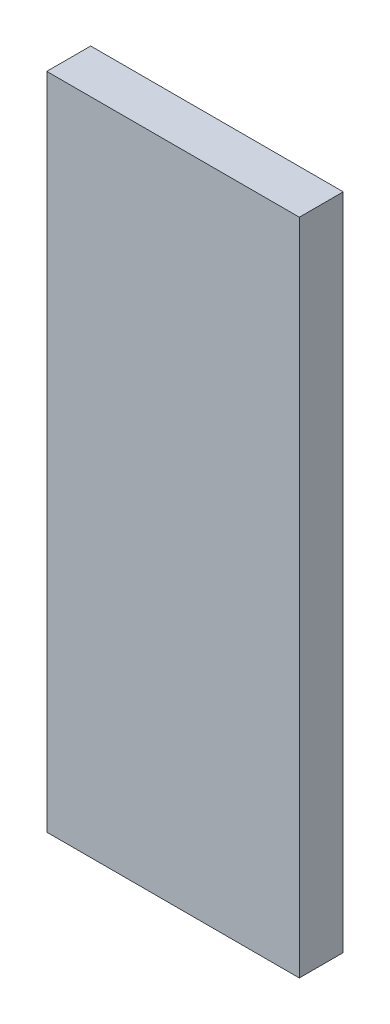
ISO-10303-21;
HEADER;
FILE_DESCRIPTION(('STEP AP214'),'2;1');
FILE_NAME('part.step','',(''),(''),'','','');
FILE_SCHEMA(('AUTOMOTIVE_DESIGN { 1 0 10303 214 1 1 1 1 }'));
ENDSEC;
DATA;
#1=APPLICATION_CONTEXT('core data for automotive mechanical design processes');
#2=APPLICATION_PROTOCOL_DEFINITION('international standard','automotive_design',2000,#1);
#3=PRODUCT_CONTEXT('',#1,'mechanical');
#4=PRODUCT('Part','Part','',(#3));
#5=PRODUCT_RELATED_PRODUCT_CATEGORY('part','',(#4));
#6=PRODUCT_DEFINITION_FORMATION('','',#4);
#7=PRODUCT_DEFINITION_CONTEXT('part definition',#1,'design');
#8=PRODUCT_DEFINITION('design','',#6,#7);
#9=PRODUCT_DEFINITION_SHAPE('','',#8);
#10=(LENGTH_UNIT() NAMED_UNIT(*) SI_UNIT(.MILLI.,.METRE.));
#11=(NAMED_UNIT(*) PLANE_ANGLE_UNIT() SI_UNIT($,.RADIAN.));
#12=(NAMED_UNIT(*) SI_UNIT($,.STERADIAN.) SOLID_ANGLE_UNIT());
#13=UNCERTAINTY_MEASURE_WITH_UNIT(LENGTH_MEASURE(1.E-05),#10,'distance_accuracy_value','');
#14=(GEOMETRIC_REPRESENTATION_CONTEXT(3) GLOBAL_UNCERTAINTY_ASSIGNED_CONTEXT((#13)) GLOBAL_UNIT_ASSIGNED_CONTEXT((#10,
#11,#12)) REPRESENTATION_CONTEXT('',''));
#15=CARTESIAN_POINT('',(0.,0.,0.));
#16=DIRECTION('',(0.,0.,1.));
#17=DIRECTION('',(1.,0.,0.));
#18=AXIS2_PLACEMENT_3D('',#15,#16,#17);
#19=CARTESIAN_POINT('',(19.,60.,-4.));
#20=DIRECTION('',(0.,-1.,0.));
#21=DIRECTION('',(0.,0.,-1.));
#22=AXIS2_PLACEMENT_3D('',#19,#20,#21);
#23=PLANE('',#22);
#24=DIRECTION('',(0.,0.,1.));
#25=VECTOR('',#24,1.);
#26=CARTESIAN_POINT('',(19.,60.,-4.));
#27=LINE('',#26,#25);
#28=CARTESIAN_POINT('',(19.,60.,-4.));
#29=VERTEX_POINT('',#28);
#30=CARTESIAN_POINT('',(19.,60.,0.));
#31=VERTEX_POINT('',#30);
#32=EDGE_CURVE('E137',#29,#31,#27,.T.);
#33=ORIENTED_EDGE('',*,*,#32,.F.);
#34=DIRECTION('',(1.,0.,0.));
#35=VECTOR('',#34,1.);
#36=CARTESIAN_POINT('',(19.,60.,-4.));
#37=LINE('',#36,#35);
#38=CARTESIAN_POINT('',(-4.,60.,-4.));
#39=VERTEX_POINT('',#38);
#40=EDGE_CURVE('E135',#39,#29,#37,.T.);
#41=ORIENTED_EDGE('',*,*,#40,.F.);
#42=DIRECTION('',(0.,0.,1.));
#43=VECTOR('',#42,1.);
#44=CARTESIAN_POINT('',(-4.,60.,-4.));
#45=LINE('',#44,#43);
#46=CARTESIAN_POINT('',(-4.,60.,0.));
#47=VERTEX_POINT('',#46);
#48=EDGE_CURVE('E147',#39,#47,#45,.T.);
#49=ORIENTED_EDGE('',*,*,#48,.T.);
#50=DIRECTION('',(1.,0.,0.));
#51=VECTOR('',#50,1.);
#52=CARTESIAN_POINT('',(19.,60.,0.));
#53=LINE('',#52,#51);
#54=EDGE_CURVE('E131',#47,#31,#53,.T.);
#55=ORIENTED_EDGE('',*,*,#54,.T.);
#56=EDGE_LOOP('',(#33,#41,#49,#55));
#57=FACE_BOUND('',#56,.T.);
#58=ADVANCED_FACE('F33',(#57),#23,.F.);
#59=CARTESIAN_POINT('',(0.,0.,0.));
#60=DIRECTION('',(0.,1.,0.));
#61=DIRECTION('',(0.,0.,1.));
#62=AXIS2_PLACEMENT_3D('',#59,#60,#61);
#63=PLANE('',#62);
#64=DIRECTION('',(-1.,0.,0.));
#65=VECTOR('',#64,1.);
#66=CARTESIAN_POINT('',(19.,0.,0.));
#67=LINE('',#66,#65);
#68=CARTESIAN_POINT('',(19.,0.,0.));
#69=VERTEX_POINT('',#68);
#70=CARTESIAN_POINT('',(-4.,0.,0.));
#71=VERTEX_POINT('',#70);
#72=EDGE_CURVE('E140',#69,#71,#67,.T.);
#73=ORIENTED_EDGE('',*,*,#72,.T.);
#74=DIRECTION('',(0.,0.,1.));
#75=VECTOR('',#74,1.);
#76=CARTESIAN_POINT('',(-4.,0.,-4.));
#77=LINE('',#76,#75);
#78=CARTESIAN_POINT('',(-4.,0.,-4.));
#79=VERTEX_POINT('',#78);
#80=EDGE_CURVE('E41',#79,#71,#77,.T.);
#81=ORIENTED_EDGE('',*,*,#80,.F.);
#82=DIRECTION('',(-1.,0.,0.));
#83=VECTOR('',#82,1.);
#84=CARTESIAN_POINT('',(19.,0.,-4.));
#85=LINE('',#84,#83);
#86=CARTESIAN_POINT('',(19.,0.,-4.));
#87=VERTEX_POINT('',#86);
#88=EDGE_CURVE('E130',#87,#79,#85,.T.);
#89=ORIENTED_EDGE('',*,*,#88,.F.);
#90=DIRECTION('',(0.,0.,1.));
#91=VECTOR('',#90,1.);
#92=CARTESIAN_POINT('',(19.,0.,-4.));
#93=LINE('',#92,#91);
#94=EDGE_CURVE('E11',#87,#69,#93,.T.);
#95=ORIENTED_EDGE('',*,*,#94,.T.);
#96=EDGE_LOOP('',(#73,#81,#89,#95));
#97=FACE_BOUND('',#96,.T.);
#98=ADVANCED_FACE('F35',(#97),#63,.F.);
#99=CARTESIAN_POINT('',(0.,0.,-4.));
#100=DIRECTION('',(0.,0.,1.));
#101=DIRECTION('',(1.,0.,0.));
#102=AXIS2_PLACEMENT_3D('',#99,#100,#101);
#103=PLANE('',#102);
#104=ORIENTED_EDGE('',*,*,#40,.T.);
#105=DIRECTION('',(0.,-1.,0.));
#106=VECTOR('',#105,1.);
#107=CARTESIAN_POINT('',(19.,0.,-4.));
#108=LINE('',#107,#106);
#109=EDGE_CURVE('E127',#29,#87,#108,.T.);
#110=ORIENTED_EDGE('',*,*,#109,.T.);
#111=ORIENTED_EDGE('',*,*,#88,.T.);
#112=DIRECTION('',(0.,1.,0.));
#113=VECTOR('',#112,1.);
#114=CARTESIAN_POINT('',(-4.,0.,-4.));
#115=LINE('',#114,#113);
#116=EDGE_CURVE('E133',#79,#39,#115,.T.);
#117=ORIENTED_EDGE('',*,*,#116,.T.);
#118=EDGE_LOOP('',(#104,#110,#111,#117));
#119=FACE_BOUND('',#118,.T.);
#120=DIRECTION('',(0.,1.,0.));
#121=VECTOR('',#120,1.);
#122=CARTESIAN_POINT('',(-1.75,60.,-4.));
#123=LINE('',#122,#121);
#124=CARTESIAN_POINT('',(-1.75000000000003,10.,-4.));
#125=VERTEX_POINT('',#124);
#126=CARTESIAN_POINT('',(-1.75000000000003,45.,-4.));
#127=VERTEX_POINT('',#126);
#128=EDGE_CURVE('E56',#125,#127,#123,.T.);
#129=ORIENTED_EDGE('',*,*,#128,.F.);
#130=DIRECTION('',(-1.,0.,0.));
#131=VECTOR('',#130,1.);
#132=CARTESIAN_POINT('',(-1.75000000000003,10.,-4.));
#133=LINE('',#132,#131);
#134=CARTESIAN_POINT('',(2.24999999999999,10.,-4.));
#135=VERTEX_POINT('',#134);
#136=EDGE_CURVE('E112',#135,#125,#133,.T.);
#137=ORIENTED_EDGE('',*,*,#136,.F.);
#138=DIRECTION('',(0.,-1.,0.));
#139=VECTOR('',#138,1.);
#140=CARTESIAN_POINT('',(2.25,60.,-4.));
#141=LINE('',#140,#139);
#142=CARTESIAN_POINT('',(2.25,45.,-4.));
#143=VERTEX_POINT('',#142);
#144=EDGE_CURVE('E108',#143,#135,#141,.T.);
#145=ORIENTED_EDGE('',*,*,#144,.F.);
#146=DIRECTION('',(-1.,0.,0.));
#147=VECTOR('',#146,1.);
#148=CARTESIAN_POINT('',(2.25,45.,-4.));
#149=LINE('',#148,#147);
#150=EDGE_CURVE('E97',#143,#127,#149,.T.);
#151=ORIENTED_EDGE('',*,*,#150,.T.);
#152=EDGE_LOOP('',(#129,#137,#145,#151));
#153=FACE_BOUND('',#152,.T.);
#154=ADVANCED_FACE('F111',(#119,#153),#103,.F.);
#155=CARTESIAN_POINT('',(0.,0.,0.));
#156=DIRECTION('',(0.,0.,1.));
#157=DIRECTION('',(1.,0.,0.));
#158=AXIS2_PLACEMENT_3D('',#155,#156,#157);
#159=PLANE('',#158);
#160=DIRECTION('',(0.,1.,0.));
#161=VECTOR('',#160,1.);
#162=CARTESIAN_POINT('',(-4.,0.,0.));
#163=LINE('',#162,#161);
#164=EDGE_CURVE('E142',#71,#47,#163,.T.);
#165=ORIENTED_EDGE('',*,*,#164,.F.);
#166=ORIENTED_EDGE('',*,*,#72,.F.);
#167=DIRECTION('',(0.,-1.,0.));
#168=VECTOR('',#167,1.);
#169=CARTESIAN_POINT('',(19.,0.,0.));
#170=LINE('',#169,#168);
#171=EDGE_CURVE('E126',#31,#69,#170,.T.);
#172=ORIENTED_EDGE('',*,*,#171,.F.);
#173=ORIENTED_EDGE('',*,*,#54,.F.);
#174=EDGE_LOOP('',(#165,#166,#172,#173));
#175=FACE_BOUND('',#174,.T.);
#176=ADVANCED_FACE('F159',(#175),#159,.T.);
#177=CARTESIAN_POINT('',(19.,0.,-4.));
#178=DIRECTION('',(-1.,0.,0.));
#179=DIRECTION('',(0.,0.,1.));
#180=AXIS2_PLACEMENT_3D('',#177,#178,#179);
#181=PLANE('',#180);
#182=ORIENTED_EDGE('',*,*,#171,.T.);
#183=ORIENTED_EDGE('',*,*,#94,.F.);
#184=ORIENTED_EDGE('',*,*,#109,.F.);
#185=ORIENTED_EDGE('',*,*,#32,.T.);
#186=EDGE_LOOP('',(#182,#183,#184,#185));
#187=FACE_BOUND('',#186,.T.);
#188=ADVANCED_FACE('F166',(#187),#181,.F.);
#189=CARTESIAN_POINT('',(-4.,0.,-4.));
#190=DIRECTION('',(1.,0.,0.));
#191=DIRECTION('',(0.,0.,-1.));
#192=AXIS2_PLACEMENT_3D('',#189,#190,#191);
#193=PLANE('',#192);
#194=ORIENTED_EDGE('',*,*,#164,.T.);
#195=ORIENTED_EDGE('',*,*,#48,.F.);
#196=ORIENTED_EDGE('',*,*,#116,.F.);
#197=ORIENTED_EDGE('',*,*,#80,.T.);
#198=EDGE_LOOP('',(#194,#195,#196,#197));
#199=FACE_BOUND('',#198,.T.);
#200=ADVANCED_FACE('F154',(#199),#193,.F.);
#201=CARTESIAN_POINT('',(-1.75,60.,-19.));
#202=DIRECTION('',(1.,0.,0.));
#203=DIRECTION('',(0.,1.,0.));
#204=AXIS2_PLACEMENT_3D('',#201,#202,#203);
#205=PLANE('',#204);
#206=ORIENTED_EDGE('',*,*,#128,.T.);
#207=DIRECTION('',(0.,0.,-1.));
#208=VECTOR('',#207,1.);
#209=CARTESIAN_POINT('',(-1.75000000000003,45.,-4.));
#210=LINE('',#209,#208);
#211=CARTESIAN_POINT('',(-1.75000000000003,45.,-19.));
#212=VERTEX_POINT('',#211);
#213=EDGE_CURVE('E100',#127,#212,#210,.T.);
#214=ORIENTED_EDGE('',*,*,#213,.T.);
#215=DIRECTION('',(0.,1.,0.));
#216=VECTOR('',#215,1.);
#217=CARTESIAN_POINT('',(-1.75,60.,-19.));
#218=LINE('',#217,#216);
#219=CARTESIAN_POINT('',(-1.75000000000003,10.,-19.));
#220=VERTEX_POINT('',#219);
#221=EDGE_CURVE('E115',#220,#212,#218,.T.);
#222=ORIENTED_EDGE('',*,*,#221,.F.);
#223=DIRECTION('',(0.,0.,1.));
#224=VECTOR('',#223,1.);
#225=CARTESIAN_POINT('',(-1.75000000000003,10.,-19.));
#226=LINE('',#225,#224);
#227=EDGE_CURVE('E120',#220,#125,#226,.T.);
#228=ORIENTED_EDGE('',*,*,#227,.T.);
#229=EDGE_LOOP('',(#206,#214,#222,#228));
#230=FACE_BOUND('',#229,.T.);
#231=ADVANCED_FACE('F181',(#230),#205,.F.);
#232=CARTESIAN_POINT('',(2.25,60.,-19.));
#233=DIRECTION('',(-1.,0.,0.));
#234=DIRECTION('',(0.,-1.,0.));
#235=AXIS2_PLACEMENT_3D('',#232,#233,#234);
#236=PLANE('',#235);
#237=DIRECTION('',(0.,-1.,0.));
#238=VECTOR('',#237,1.);
#239=CARTESIAN_POINT('',(2.25,60.,-19.));
#240=LINE('',#239,#238);
#241=CARTESIAN_POINT('',(2.25,45.,-19.));
#242=VERTEX_POINT('',#241);
#243=CARTESIAN_POINT('',(2.24999999999999,10.,-19.));
#244=VERTEX_POINT('',#243);
#245=EDGE_CURVE('E109',#242,#244,#240,.T.);
#246=ORIENTED_EDGE('',*,*,#245,.F.);
#247=DIRECTION('',(0.,0.,-1.));
#248=VECTOR('',#247,1.);
#249=CARTESIAN_POINT('',(2.25,45.,-4.));
#250=LINE('',#249,#248);
#251=EDGE_CURVE('E48',#143,#242,#250,.T.);
#252=ORIENTED_EDGE('',*,*,#251,.F.);
#253=ORIENTED_EDGE('',*,*,#144,.T.);
#254=DIRECTION('',(0.,0.,1.));
#255=VECTOR('',#254,1.);
#256=CARTESIAN_POINT('',(2.24999999999999,10.,-19.));
#257=LINE('',#256,#255);
#258=EDGE_CURVE('E123',#244,#135,#257,.T.);
#259=ORIENTED_EDGE('',*,*,#258,.F.);
#260=EDGE_LOOP('',(#246,#252,#253,#259));
#261=FACE_BOUND('',#260,.T.);
#262=ADVANCED_FACE('F106',(#261),#236,.F.);
#263=CARTESIAN_POINT('',(-1.75000000000003,10.,-19.));
#264=DIRECTION('',(0.,1.,0.));
#265=DIRECTION('',(-1.,0.,0.));
#266=AXIS2_PLACEMENT_3D('',#263,#264,#265);
#267=PLANE('',#266);
#268=ORIENTED_EDGE('',*,*,#136,.T.);
#269=ORIENTED_EDGE('',*,*,#227,.F.);
#270=DIRECTION('',(-1.,0.,0.));
#271=VECTOR('',#270,1.);
#272=CARTESIAN_POINT('',(-1.75000000000003,10.,-19.));
#273=LINE('',#272,#271);
#274=EDGE_CURVE('E124',#244,#220,#273,.T.);
#275=ORIENTED_EDGE('',*,*,#274,.F.);
#276=ORIENTED_EDGE('',*,*,#258,.T.);
#277=EDGE_LOOP('',(#268,#269,#275,#276));
#278=FACE_BOUND('',#277,.T.);
#279=ADVANCED_FACE('F214',(#278),#267,.F.);
#280=CARTESIAN_POINT('',(0.,0.,-19.));
#281=DIRECTION('',(0.,0.,1.));
#282=DIRECTION('',(1.,0.,0.));
#283=AXIS2_PLACEMENT_3D('',#280,#281,#282);
#284=PLANE('',#283);
#285=ORIENTED_EDGE('',*,*,#221,.T.);
#286=DIRECTION('',(-1.,0.,0.));
#287=VECTOR('',#286,1.);
#288=CARTESIAN_POINT('',(2.25,45.,-19.));
#289=LINE('',#288,#287);
#290=EDGE_CURVE('E102',#242,#212,#289,.T.);
#291=ORIENTED_EDGE('',*,*,#290,.F.);
#292=ORIENTED_EDGE('',*,*,#245,.T.);
#293=ORIENTED_EDGE('',*,*,#274,.T.);
#294=EDGE_LOOP('',(#285,#291,#292,#293));
#295=FACE_BOUND('',#294,.T.);
#296=ADVANCED_FACE('F221',(#295),#284,.F.);
#297=CARTESIAN_POINT('',(2.25,45.,-4.));
#298=DIRECTION('',(0.,-1.,0.));
#299=DIRECTION('',(0.,0.,-1.));
#300=AXIS2_PLACEMENT_3D('',#297,#298,#299);
#301=PLANE('',#300);
#302=ORIENTED_EDGE('',*,*,#290,.T.);
#303=ORIENTED_EDGE('',*,*,#213,.F.);
#304=ORIENTED_EDGE('',*,*,#150,.F.);
#305=ORIENTED_EDGE('',*,*,#251,.T.);
#306=EDGE_LOOP('',(#302,#303,#304,#305));
#307=FACE_BOUND('',#306,.T.);
#308=ADVANCED_FACE('F98',(#307),#301,.F.);
#309=CLOSED_SHELL('',(#58,#98,#154,#176,#188,#200,#231,#262,#279,#296,#308));
#310=MANIFOLD_SOLID_BREP('B2',#309);
#311=ADVANCED_BREP_SHAPE_REPRESENTATION('',(#18,#310),#14);
#312=SHAPE_DEFINITION_REPRESENTATION(#9,#311);
ENDSEC;
END-ISO-10303-21;
